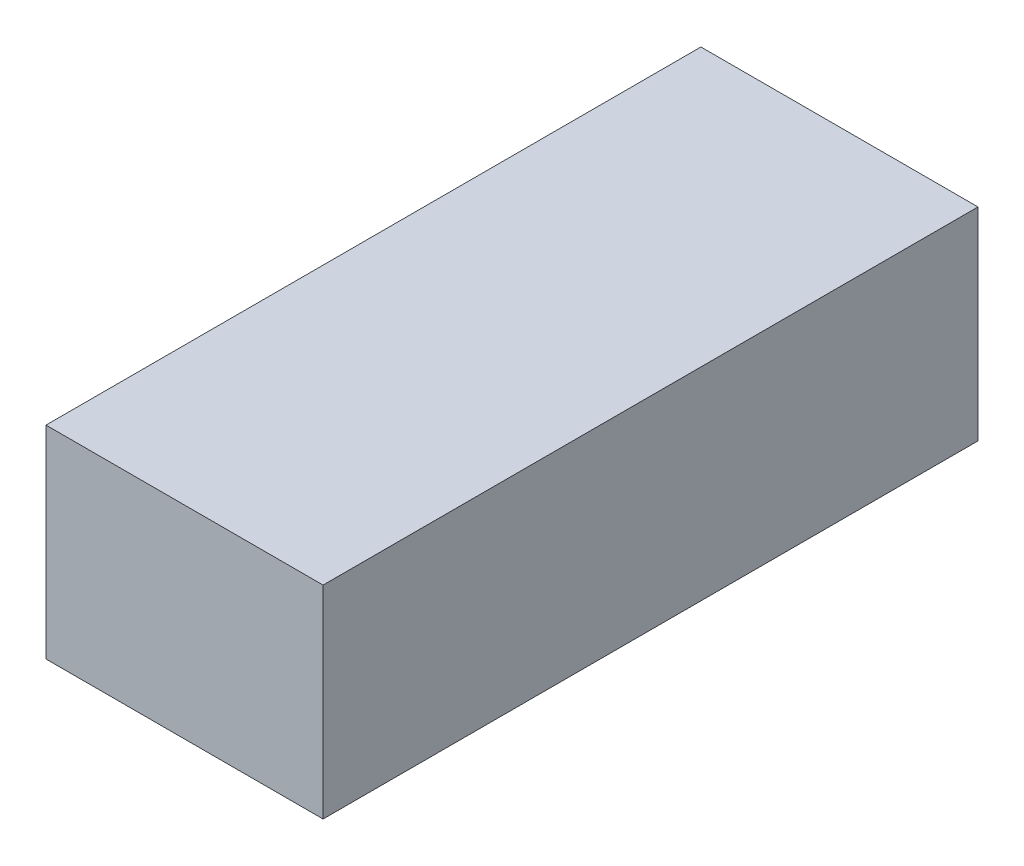
ISO-10303-21;
HEADER;
FILE_DESCRIPTION(('STEP AP214'),'2;1');
FILE_NAME('part.step','',(''),(''),'','','');
FILE_SCHEMA(('AUTOMOTIVE_DESIGN { 1 0 10303 214 1 1 1 1 }'));
ENDSEC;
DATA;
#1=APPLICATION_CONTEXT('core data for automotive mechanical design processes');
#2=APPLICATION_PROTOCOL_DEFINITION('international standard','automotive_design',2000,#1);
#3=PRODUCT_CONTEXT('',#1,'mechanical');
#4=PRODUCT('Part','Part','',(#3));
#5=PRODUCT_RELATED_PRODUCT_CATEGORY('part','',(#4));
#6=PRODUCT_DEFINITION_FORMATION('','',#4);
#7=PRODUCT_DEFINITION_CONTEXT('part definition',#1,'design');
#8=PRODUCT_DEFINITION('design','',#6,#7);
#9=PRODUCT_DEFINITION_SHAPE('','',#8);
#10=(LENGTH_UNIT() NAMED_UNIT(*) SI_UNIT(.MILLI.,.METRE.));
#11=(NAMED_UNIT(*) PLANE_ANGLE_UNIT() SI_UNIT($,.RADIAN.));
#12=(NAMED_UNIT(*) SI_UNIT($,.STERADIAN.) SOLID_ANGLE_UNIT());
#13=UNCERTAINTY_MEASURE_WITH_UNIT(LENGTH_MEASURE(1.E-05),#10,'distance_accuracy_value','');
#14=(GEOMETRIC_REPRESENTATION_CONTEXT(3) GLOBAL_UNCERTAINTY_ASSIGNED_CONTEXT((#13)) GLOBAL_UNIT_ASSIGNED_CONTEXT((#10,
#11,#12)) REPRESENTATION_CONTEXT('',''));
#15=CARTESIAN_POINT('',(0.,0.,0.));
#16=DIRECTION('',(0.,0.,1.));
#17=DIRECTION('',(1.,0.,0.));
#18=AXIS2_PLACEMENT_3D('',#15,#16,#17);
#19=CARTESIAN_POINT('',(-34.925,51.0794,-165.1));
#20=DIRECTION('',(1.,0.,0.));
#21=DIRECTION('',(0.,0.,-1.));
#22=AXIS2_PLACEMENT_3D('',#19,#20,#21);
#23=PLANE('',#22);
#24=DIRECTION('',(0.,0.,1.));
#25=VECTOR('',#24,1.);
#26=CARTESIAN_POINT('',(-34.925,0.,-165.1));
#27=LINE('',#26,#25);
#28=CARTESIAN_POINT('',(-34.925,0.,-165.1));
#29=VERTEX_POINT('',#28);
#30=CARTESIAN_POINT('',(-34.925,0.,0.));
#31=VERTEX_POINT('',#30);
#32=EDGE_CURVE('E106',#29,#31,#27,.T.);
#33=ORIENTED_EDGE('',*,*,#32,.T.);
#34=DIRECTION('',(0.,-1.,0.));
#35=VECTOR('',#34,1.);
#36=CARTESIAN_POINT('',(-34.925,51.0794,0.));
#37=LINE('',#36,#35);
#38=CARTESIAN_POINT('',(-34.925,51.0794,0.));
#39=VERTEX_POINT('',#38);
#40=EDGE_CURVE('E11',#39,#31,#37,.T.);
#41=ORIENTED_EDGE('',*,*,#40,.F.);
#42=DIRECTION('',(0.,0.,1.));
#43=VECTOR('',#42,1.);
#44=CARTESIAN_POINT('',(-34.925,51.0794,-165.1));
#45=LINE('',#44,#43);
#46=CARTESIAN_POINT('',(-34.925,51.0794,-165.1));
#47=VERTEX_POINT('',#46);
#48=EDGE_CURVE('E92',#47,#39,#45,.T.);
#49=ORIENTED_EDGE('',*,*,#48,.F.);
#50=DIRECTION('',(0.,-1.,0.));
#51=VECTOR('',#50,1.);
#52=CARTESIAN_POINT('',(-34.925,51.0794,-165.1));
#53=LINE('',#52,#51);
#54=EDGE_CURVE('E102',#47,#29,#53,.T.);
#55=ORIENTED_EDGE('',*,*,#54,.T.);
#56=EDGE_LOOP('',(#33,#41,#49,#55));
#57=FACE_BOUND('',#56,.T.);
#58=ADVANCED_FACE('F40',(#57),#23,.F.);
#59=CARTESIAN_POINT('',(-34.925,51.0794,0.));
#60=DIRECTION('',(0.,0.,-1.));
#61=DIRECTION('',(-1.,0.,0.));
#62=AXIS2_PLACEMENT_3D('',#59,#60,#61);
#63=PLANE('',#62);
#64=DIRECTION('',(1.,0.,0.));
#65=VECTOR('',#64,1.);
#66=CARTESIAN_POINT('',(-34.925,0.,0.));
#67=LINE('',#66,#65);
#68=CARTESIAN_POINT('',(34.925,0.,0.));
#69=VERTEX_POINT('',#68);
#70=EDGE_CURVE('E97',#31,#69,#67,.T.);
#71=ORIENTED_EDGE('',*,*,#70,.T.);
#72=DIRECTION('',(0.,-1.,0.));
#73=VECTOR('',#72,1.);
#74=CARTESIAN_POINT('',(34.925,51.0794,0.));
#75=LINE('',#74,#73);
#76=CARTESIAN_POINT('',(34.925,51.0794,0.));
#77=VERTEX_POINT('',#76);
#78=EDGE_CURVE('E49',#77,#69,#75,.T.);
#79=ORIENTED_EDGE('',*,*,#78,.F.);
#80=DIRECTION('',(1.,0.,0.));
#81=VECTOR('',#80,1.);
#82=CARTESIAN_POINT('',(-34.925,51.0794,0.));
#83=LINE('',#82,#81);
#84=EDGE_CURVE('E87',#39,#77,#83,.T.);
#85=ORIENTED_EDGE('',*,*,#84,.F.);
#86=ORIENTED_EDGE('',*,*,#40,.T.);
#87=EDGE_LOOP('',(#71,#79,#85,#86));
#88=FACE_BOUND('',#87,.T.);
#89=ADVANCED_FACE('F96',(#88),#63,.F.);
#90=CARTESIAN_POINT('',(34.925,51.0794,-165.1));
#91=DIRECTION('',(-1.,0.,0.));
#92=DIRECTION('',(0.,0.,1.));
#93=AXIS2_PLACEMENT_3D('',#90,#91,#92);
#94=PLANE('',#93);
#95=DIRECTION('',(0.,0.,-1.));
#96=VECTOR('',#95,1.);
#97=CARTESIAN_POINT('',(34.925,0.,-165.1));
#98=LINE('',#97,#96);
#99=CARTESIAN_POINT('',(34.925,0.,-165.1));
#100=VERTEX_POINT('',#99);
#101=EDGE_CURVE('E74',#69,#100,#98,.T.);
#102=ORIENTED_EDGE('',*,*,#101,.T.);
#103=DIRECTION('',(0.,-1.,0.));
#104=VECTOR('',#103,1.);
#105=CARTESIAN_POINT('',(34.925,51.0794,-165.1));
#106=LINE('',#105,#104);
#107=CARTESIAN_POINT('',(34.925,51.0794,-165.1));
#108=VERTEX_POINT('',#107);
#109=EDGE_CURVE('E98',#108,#100,#106,.T.);
#110=ORIENTED_EDGE('',*,*,#109,.F.);
#111=DIRECTION('',(0.,0.,-1.));
#112=VECTOR('',#111,1.);
#113=CARTESIAN_POINT('',(34.925,51.0794,-165.1));
#114=LINE('',#113,#112);
#115=EDGE_CURVE('E90',#77,#108,#114,.T.);
#116=ORIENTED_EDGE('',*,*,#115,.F.);
#117=ORIENTED_EDGE('',*,*,#78,.T.);
#118=EDGE_LOOP('',(#102,#110,#116,#117));
#119=FACE_BOUND('',#118,.T.);
#120=ADVANCED_FACE('F99',(#119),#94,.F.);
#121=CARTESIAN_POINT('',(-34.925,51.0794,-165.1));
#122=DIRECTION('',(0.,0.,1.));
#123=DIRECTION('',(1.,0.,0.));
#124=AXIS2_PLACEMENT_3D('',#121,#122,#123);
#125=PLANE('',#124);
#126=DIRECTION('',(-1.,0.,0.));
#127=VECTOR('',#126,1.);
#128=CARTESIAN_POINT('',(-34.925,0.,-165.1));
#129=LINE('',#128,#127);
#130=EDGE_CURVE('E80',#100,#29,#129,.T.);
#131=ORIENTED_EDGE('',*,*,#130,.T.);
#132=ORIENTED_EDGE('',*,*,#54,.F.);
#133=DIRECTION('',(-1.,0.,0.));
#134=VECTOR('',#133,1.);
#135=CARTESIAN_POINT('',(-34.925,51.0794,-165.1));
#136=LINE('',#135,#134);
#137=EDGE_CURVE('E57',#108,#47,#136,.T.);
#138=ORIENTED_EDGE('',*,*,#137,.F.);
#139=ORIENTED_EDGE('',*,*,#109,.T.);
#140=EDGE_LOOP('',(#131,#132,#138,#139));
#141=FACE_BOUND('',#140,.T.);
#142=ADVANCED_FACE('F115',(#141),#125,.F.);
#143=CARTESIAN_POINT('',(0.,51.0794,0.));
#144=DIRECTION('',(0.,1.,0.));
#145=DIRECTION('',(0.,0.,1.));
#146=AXIS2_PLACEMENT_3D('',#143,#144,#145);
#147=PLANE('',#146);
#148=ORIENTED_EDGE('',*,*,#48,.T.);
#149=ORIENTED_EDGE('',*,*,#84,.T.);
#150=ORIENTED_EDGE('',*,*,#115,.T.);
#151=ORIENTED_EDGE('',*,*,#137,.T.);
#152=EDGE_LOOP('',(#148,#149,#150,#151));
#153=FACE_BOUND('',#152,.T.);
#154=ADVANCED_FACE('F88',(#153),#147,.T.);
#155=CARTESIAN_POINT('',(0.,0.,0.));
#156=DIRECTION('',(0.,1.,0.));
#157=DIRECTION('',(0.,0.,1.));
#158=AXIS2_PLACEMENT_3D('',#155,#156,#157);
#159=PLANE('',#158);
#160=ORIENTED_EDGE('',*,*,#32,.F.);
#161=ORIENTED_EDGE('',*,*,#130,.F.);
#162=ORIENTED_EDGE('',*,*,#101,.F.);
#163=ORIENTED_EDGE('',*,*,#70,.F.);
#164=EDGE_LOOP('',(#160,#161,#162,#163));
#165=FACE_BOUND('',#164,.T.);
#166=ADVANCED_FACE('F118',(#165),#159,.F.);
#167=CLOSED_SHELL('',(#58,#89,#120,#142,#154,#166));
#168=MANIFOLD_SOLID_BREP('B2',#167);
#169=ADVANCED_BREP_SHAPE_REPRESENTATION('',(#18,#168),#14);
#170=SHAPE_DEFINITION_REPRESENTATION(#9,#169);
ENDSEC;
END-ISO-10303-21;
